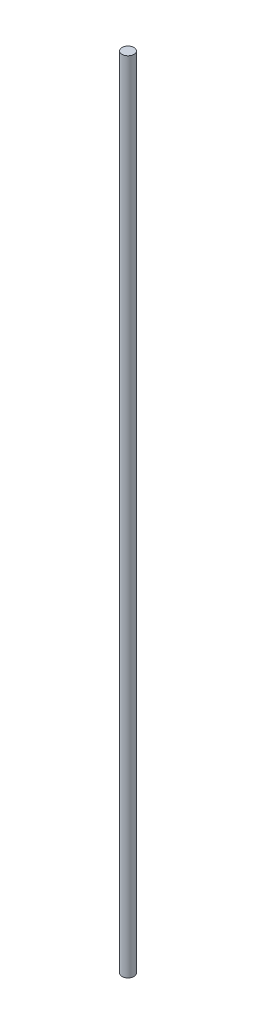
ISO-10303-21;
HEADER;
FILE_DESCRIPTION(('STEP AP214'),'2;1');
FILE_NAME('part.step','',(''),(''),'','','');
FILE_SCHEMA(('AUTOMOTIVE_DESIGN { 1 0 10303 214 1 1 1 1 }'));
ENDSEC;
DATA;
#1=APPLICATION_CONTEXT('core data for automotive mechanical design processes');
#2=APPLICATION_PROTOCOL_DEFINITION('international standard','automotive_design',2000,#1);
#3=PRODUCT_CONTEXT('',#1,'mechanical');
#4=PRODUCT('Part','Part','',(#3));
#5=PRODUCT_RELATED_PRODUCT_CATEGORY('part','',(#4));
#6=PRODUCT_DEFINITION_FORMATION('','',#4);
#7=PRODUCT_DEFINITION_CONTEXT('part definition',#1,'design');
#8=PRODUCT_DEFINITION('design','',#6,#7);
#9=PRODUCT_DEFINITION_SHAPE('','',#8);
#10=(LENGTH_UNIT() NAMED_UNIT(*) SI_UNIT(.MILLI.,.METRE.));
#11=(NAMED_UNIT(*) PLANE_ANGLE_UNIT() SI_UNIT($,.RADIAN.));
#12=(NAMED_UNIT(*) SI_UNIT($,.STERADIAN.) SOLID_ANGLE_UNIT());
#13=UNCERTAINTY_MEASURE_WITH_UNIT(LENGTH_MEASURE(1.E-05),#10,'distance_accuracy_value','');
#14=(GEOMETRIC_REPRESENTATION_CONTEXT(3) GLOBAL_UNCERTAINTY_ASSIGNED_CONTEXT((#13)) GLOBAL_UNIT_ASSIGNED_CONTEXT((#10,
#11,#12)) REPRESENTATION_CONTEXT('',''));
#15=CARTESIAN_POINT('',(0.,0.,0.));
#16=DIRECTION('',(0.,0.,1.));
#17=DIRECTION('',(1.,0.,0.));
#18=AXIS2_PLACEMENT_3D('',#15,#16,#17);
#19=CARTESIAN_POINT('',(0.,1000.,0.));
#20=DIRECTION('',(0.,-1.,0.));
#21=DIRECTION('',(0.,0.,-1.));
#22=AXIS2_PLACEMENT_3D('',#19,#20,#21);
#23=CYLINDRICAL_SURFACE('',#22,7.5);
#24=CARTESIAN_POINT('',(0.,1000.,0.));
#25=DIRECTION('',(0.,1.,0.));
#26=DIRECTION('',(0.,0.,1.));
#27=AXIS2_PLACEMENT_3D('',#24,#25,#26);
#28=CIRCLE('',#27,7.5);
#29=CARTESIAN_POINT('',(0.,1000.,7.5));
#30=VERTEX_POINT('',#29);
#31=EDGE_CURVE('E10',#30,#30,#28,.T.);
#32=ORIENTED_EDGE('',*,*,#31,.F.);
#33=EDGE_LOOP('',(#32));
#34=FACE_BOUND('',#33,.T.);
#35=CARTESIAN_POINT('',(0.,0.,0.));
#36=DIRECTION('',(0.,1.,0.));
#37=DIRECTION('',(0.,0.,1.));
#38=AXIS2_PLACEMENT_3D('',#35,#36,#37);
#39=CIRCLE('',#38,7.5);
#40=CARTESIAN_POINT('',(0.,0.,7.5));
#41=VERTEX_POINT('',#40);
#42=EDGE_CURVE('E32',#41,#41,#39,.T.);
#43=ORIENTED_EDGE('',*,*,#42,.T.);
#44=EDGE_LOOP('',(#43));
#45=FACE_BOUND('',#44,.T.);
#46=ADVANCED_FACE('F29',(#34,#45),#23,.T.);
#47=CARTESIAN_POINT('',(0.,1000.,0.));
#48=DIRECTION('',(0.,1.,0.));
#49=DIRECTION('',(0.,0.,1.));
#50=AXIS2_PLACEMENT_3D('',#47,#48,#49);
#51=PLANE('',#50);
#52=ORIENTED_EDGE('',*,*,#31,.T.);
#53=EDGE_LOOP('',(#52));
#54=FACE_BOUND('',#53,.T.);
#55=ADVANCED_FACE('F44',(#54),#51,.T.);
#56=CARTESIAN_POINT('',(0.,0.,0.));
#57=DIRECTION('',(0.,1.,0.));
#58=DIRECTION('',(0.,0.,1.));
#59=AXIS2_PLACEMENT_3D('',#56,#57,#58);
#60=PLANE('',#59);
#61=ORIENTED_EDGE('',*,*,#42,.F.);
#62=EDGE_LOOP('',(#61));
#63=FACE_BOUND('',#62,.T.);
#64=ADVANCED_FACE('F42',(#63),#60,.F.);
#65=CLOSED_SHELL('',(#46,#55,#64));
#66=MANIFOLD_SOLID_BREP('B2',#65);
#67=ADVANCED_BREP_SHAPE_REPRESENTATION('',(#18,#66),#14);
#68=SHAPE_DEFINITION_REPRESENTATION(#9,#67);
ENDSEC;
END-ISO-10303-21;
